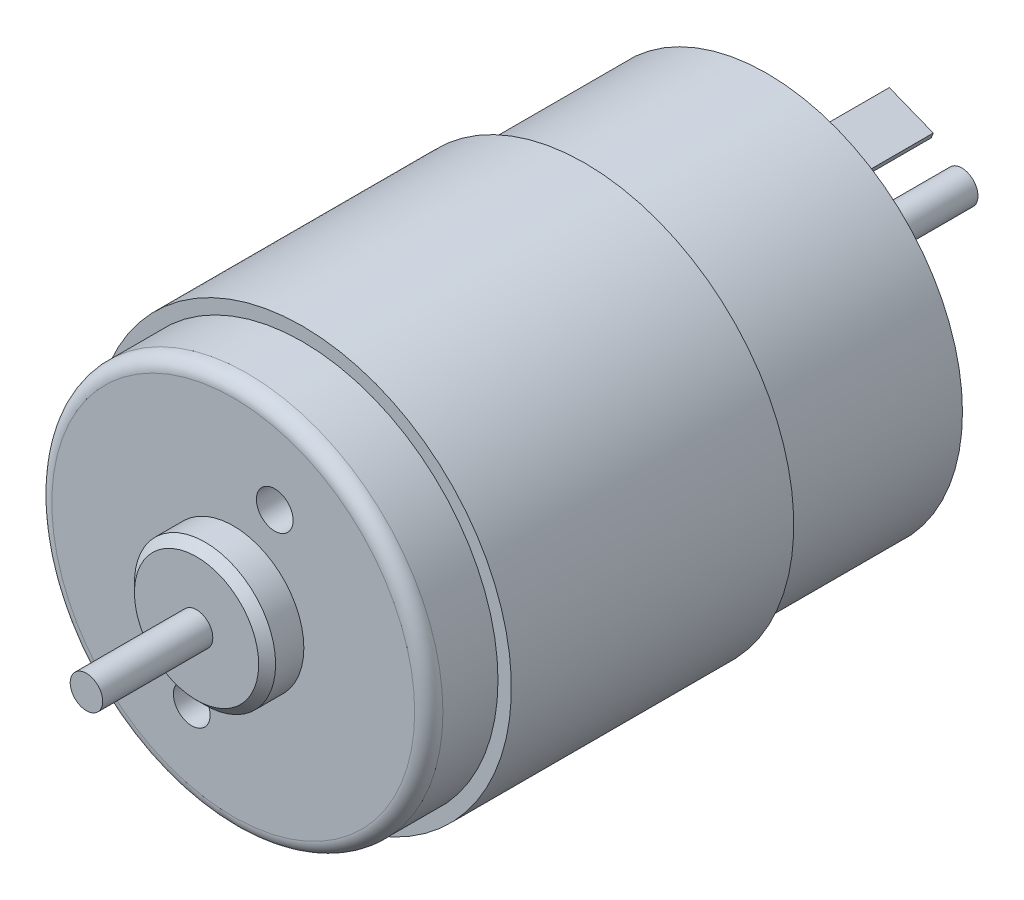
ISO-10303-21;
HEADER;
FILE_DESCRIPTION(('STEP AP214'),'2;1');
FILE_NAME('part.step','',(''),(''),'','','');
FILE_SCHEMA(('AUTOMOTIVE_DESIGN { 1 0 10303 214 1 1 1 1 }'));
ENDSEC;
DATA;
#1=APPLICATION_CONTEXT('core data for automotive mechanical design processes');
#2=APPLICATION_PROTOCOL_DEFINITION('international standard','automotive_design',2000,#1);
#3=PRODUCT_CONTEXT('',#1,'mechanical');
#4=PRODUCT('Part','Part','',(#3));
#5=PRODUCT_RELATED_PRODUCT_CATEGORY('part','',(#4));
#6=PRODUCT_DEFINITION_FORMATION('','',#4);
#7=PRODUCT_DEFINITION_CONTEXT('part definition',#1,'design');
#8=PRODUCT_DEFINITION('design','',#6,#7);
#9=PRODUCT_DEFINITION_SHAPE('','',#8);
#10=(LENGTH_UNIT() NAMED_UNIT(*) SI_UNIT(.MILLI.,.METRE.));
#11=(NAMED_UNIT(*) PLANE_ANGLE_UNIT() SI_UNIT($,.RADIAN.));
#12=(NAMED_UNIT(*) SI_UNIT($,.STERADIAN.) SOLID_ANGLE_UNIT());
#13=UNCERTAINTY_MEASURE_WITH_UNIT(LENGTH_MEASURE(1.E-05),#10,'distance_accuracy_value','');
#14=(GEOMETRIC_REPRESENTATION_CONTEXT(3) GLOBAL_UNCERTAINTY_ASSIGNED_CONTEXT((#13)) GLOBAL_UNIT_ASSIGNED_CONTEXT((#10,
#11,#12)) REPRESENTATION_CONTEXT('',''));
#15=CARTESIAN_POINT('',(0.,0.,0.));
#16=DIRECTION('',(0.,0.,1.));
#17=DIRECTION('',(1.,0.,0.));
#18=AXIS2_PLACEMENT_3D('',#15,#16,#17);
#19=CARTESIAN_POINT('',(0.,0.,0.));
#20=DIRECTION('',(0.,0.,-1.));
#21=DIRECTION('',(0.,1.,0.));
#22=AXIS2_PLACEMENT_3D('',#19,#20,#21);
#23=PLANE('',#22);
#24=CARTESIAN_POINT('',(0.,0.,0.));
#25=DIRECTION('',(0.,0.,-1.));
#26=DIRECTION('',(0.,1.,0.));
#27=AXIS2_PLACEMENT_3D('',#24,#25,#26);
#28=CIRCLE('',#27,5.);
#29=CARTESIAN_POINT('',(0.,5.,0.));
#30=VERTEX_POINT('',#29);
#31=EDGE_CURVE('E251',#30,#30,#28,.T.);
#32=ORIENTED_EDGE('',*,*,#31,.F.);
#33=EDGE_LOOP('',(#32));
#34=FACE_BOUND('',#33,.T.);
#35=CARTESIAN_POINT('',(0.,0.,0.));
#36=DIRECTION('',(0.,0.,-1.));
#37=DIRECTION('',(0.,1.,0.));
#38=AXIS2_PLACEMENT_3D('',#35,#36,#37);
#39=CIRCLE('',#38,13.85);
#40=CARTESIAN_POINT('',(0.,-13.85,0.));
#41=VERTEX_POINT('',#40);
#42=EDGE_CURVE('E160',#41,#41,#39,.T.);
#43=ORIENTED_EDGE('',*,*,#42,.T.);
#44=EDGE_LOOP('',(#43));
#45=FACE_BOUND('',#44,.T.);
#46=DIRECTION('',(-0.93007568020905,0.367367975038207,0.));
#47=VECTOR('',#46,1.);
#48=CARTESIAN_POINT('',(2.51990775857389,10.9391814085095,0.));
#49=LINE('',#48,#47);
#50=CARTESIAN_POINT('',(5.63566128727422,9.70849869213148,0.));
#51=VERTEX_POINT('',#50);
#52=CARTESIAN_POINT('',(2.51990775857389,10.9391814085095,0.));
#53=VERTEX_POINT('',#52);
#54=EDGE_CURVE('E131',#51,#53,#49,.T.);
#55=ORIENTED_EDGE('',*,*,#54,.F.);
#56=DIRECTION('',(-0.367367975038209,-0.93007568020905,0.));
#57=VECTOR('',#56,1.);
#58=CARTESIAN_POINT('',(5.63566128727422,9.70849869213148,0.));
#59=LINE('',#58,#57);
#60=CARTESIAN_POINT('',(5.7826084772895,10.0805289642151,0.));
#61=VERTEX_POINT('',#60);
#62=EDGE_CURVE('E128',#61,#51,#59,.T.);
#63=ORIENTED_EDGE('',*,*,#62,.F.);
#64=DIRECTION('',(0.93007568020905,-0.367367975038207,0.));
#65=VECTOR('',#64,1.);
#66=CARTESIAN_POINT('',(5.7826084772895,10.0805289642151,0.));
#67=LINE('',#66,#65);
#68=CARTESIAN_POINT('',(2.66685494858918,11.3112116805931,0.));
#69=VERTEX_POINT('',#68);
#70=EDGE_CURVE('E140',#69,#61,#67,.T.);
#71=ORIENTED_EDGE('',*,*,#70,.F.);
#72=DIRECTION('',(0.367367975038208,0.93007568020905,0.));
#73=VECTOR('',#72,1.);
#74=CARTESIAN_POINT('',(2.66685494858918,11.3112116805931,0.));
#75=LINE('',#74,#73);
#76=EDGE_CURVE('E148',#53,#69,#75,.T.);
#77=ORIENTED_EDGE('',*,*,#76,.F.);
#78=EDGE_LOOP('',(#55,#63,#71,#77));
#79=FACE_BOUND('',#78,.T.);
#80=DIRECTION('',(-0.930075680209049,0.367367975038209,0.));
#81=VECTOR('',#80,1.);
#82=CARTESIAN_POINT('',(-5.7826084772895,-10.0805289642151,0.));
#83=LINE('',#82,#81);
#84=CARTESIAN_POINT('',(-2.66685494858918,-11.3112116805931,0.));
#85=VERTEX_POINT('',#84);
#86=CARTESIAN_POINT('',(-5.7826084772895,-10.0805289642151,0.));
#87=VERTEX_POINT('',#86);
#88=EDGE_CURVE('E275',#85,#87,#83,.T.);
#89=ORIENTED_EDGE('',*,*,#88,.F.);
#90=DIRECTION('',(-0.36736797503821,-0.930075680209049,0.));
#91=VECTOR('',#90,1.);
#92=CARTESIAN_POINT('',(-2.66685494858918,-11.3112116805931,0.));
#93=LINE('',#92,#91);
#94=CARTESIAN_POINT('',(-2.5199077585739,-10.9391814085095,0.));
#95=VERTEX_POINT('',#94);
#96=EDGE_CURVE('E126',#95,#85,#93,.T.);
#97=ORIENTED_EDGE('',*,*,#96,.F.);
#98=DIRECTION('',(0.930075680209049,-0.367367975038209,0.));
#99=VECTOR('',#98,1.);
#100=CARTESIAN_POINT('',(-2.5199077585739,-10.9391814085095,0.));
#101=LINE('',#100,#99);
#102=CARTESIAN_POINT('',(-5.63566128727422,-9.7084986921315,0.));
#103=VERTEX_POINT('',#102);
#104=EDGE_CURVE('E122',#103,#95,#101,.T.);
#105=ORIENTED_EDGE('',*,*,#104,.F.);
#106=DIRECTION('',(0.367367975038208,0.93007568020905,0.));
#107=VECTOR('',#106,1.);
#108=CARTESIAN_POINT('',(-5.63566128727422,-9.70849869213149,0.));
#109=LINE('',#108,#107);
#110=EDGE_CURVE('E277',#87,#103,#109,.T.);
#111=ORIENTED_EDGE('',*,*,#110,.F.);
#112=EDGE_LOOP('',(#89,#97,#105,#111));
#113=FACE_BOUND('',#112,.T.);
#114=ADVANCED_FACE('F37',(#34,#45,#79,#113),#23,.T.);
#115=CARTESIAN_POINT('',(0.,0.,32.9));
#116=DIRECTION('',(0.,0.,-1.));
#117=DIRECTION('',(0.,1.,0.));
#118=AXIS2_PLACEMENT_3D('',#115,#116,#117);
#119=CYLINDRICAL_SURFACE('',#118,14.8);
#120=CARTESIAN_POINT('',(0.,0.,32.9));
#121=DIRECTION('',(0.,0.,-1.));
#122=DIRECTION('',(0.,1.,0.));
#123=AXIS2_PLACEMENT_3D('',#120,#121,#122);
#124=CIRCLE('',#123,14.8);
#125=CARTESIAN_POINT('',(0.,14.8,32.9));
#126=VERTEX_POINT('',#125);
#127=EDGE_CURVE('E168',#126,#126,#124,.T.);
#128=ORIENTED_EDGE('',*,*,#127,.T.);
#129=EDGE_LOOP('',(#128));
#130=FACE_BOUND('',#129,.T.);
#131=CARTESIAN_POINT('',(0.,0.,12.9));
#132=DIRECTION('',(0.,0.,-1.));
#133=DIRECTION('',(0.,1.,0.));
#134=AXIS2_PLACEMENT_3D('',#131,#132,#133);
#135=CIRCLE('',#134,14.8);
#136=CARTESIAN_POINT('',(0.,14.8,12.9));
#137=VERTEX_POINT('',#136);
#138=EDGE_CURVE('E163',#137,#137,#135,.T.);
#139=ORIENTED_EDGE('',*,*,#138,.F.);
#140=EDGE_LOOP('',(#139));
#141=FACE_BOUND('',#140,.T.);
#142=ADVANCED_FACE('F198',(#130,#141),#119,.T.);
#143=CARTESIAN_POINT('',(14.8,0.,32.9));
#144=DIRECTION('',(0.,0.,1.));
#145=DIRECTION('',(0.,-1.,0.));
#146=AXIS2_PLACEMENT_3D('',#143,#144,#145);
#147=PLANE('',#146);
#148=CARTESIAN_POINT('',(0.,0.,32.9));
#149=DIRECTION('',(0.,0.,1.));
#150=DIRECTION('',(1.,0.,0.));
#151=AXIS2_PLACEMENT_3D('',#148,#149,#150);
#152=CIRCLE('',#151,13.85);
#153=CARTESIAN_POINT('',(13.85,0.,32.9));
#154=VERTEX_POINT('',#153);
#155=EDGE_CURVE('E268',#154,#154,#152,.T.);
#156=ORIENTED_EDGE('',*,*,#155,.F.);
#157=EDGE_LOOP('',(#156));
#158=FACE_BOUND('',#157,.T.);
#159=ORIENTED_EDGE('',*,*,#127,.F.);
#160=EDGE_LOOP('',(#159));
#161=FACE_BOUND('',#160,.T.);
#162=ADVANCED_FACE('F204',(#158,#161),#147,.T.);
#163=CARTESIAN_POINT('',(0.,0.,12.9));
#164=DIRECTION('',(0.,0.,-1.));
#165=DIRECTION('',(0.,1.,0.));
#166=AXIS2_PLACEMENT_3D('',#163,#164,#165);
#167=PLANE('',#166);
#168=CARTESIAN_POINT('',(0.,0.,12.9));
#169=DIRECTION('',(0.,0.,-1.));
#170=DIRECTION('',(0.,1.,0.));
#171=AXIS2_PLACEMENT_3D('',#168,#169,#170);
#172=CIRCLE('',#171,13.85);
#173=CARTESIAN_POINT('',(0.,-13.85,12.9));
#174=VERTEX_POINT('',#173);
#175=EDGE_CURVE('E159',#174,#174,#172,.T.);
#176=ORIENTED_EDGE('',*,*,#175,.F.);
#177=EDGE_LOOP('',(#176));
#178=FACE_BOUND('',#177,.T.);
#179=ORIENTED_EDGE('',*,*,#138,.T.);
#180=EDGE_LOOP('',(#179));
#181=FACE_BOUND('',#180,.T.);
#182=ADVANCED_FACE('F216',(#178,#181),#167,.T.);
#183=CARTESIAN_POINT('',(0.,0.,0.));
#184=DIRECTION('',(0.,0.,1.));
#185=DIRECTION('',(0.,-1.,0.));
#186=AXIS2_PLACEMENT_3D('',#183,#184,#185);
#187=CYLINDRICAL_SURFACE('',#186,13.85);
#188=CARTESIAN_POINT('',(0.,-13.85,0.));
#189=CARTESIAN_POINT('',(0.,-13.85,0.134375000000003));
#190=CARTESIAN_POINT('',(0.,-13.85,0.268750000000003));
#191=CARTESIAN_POINT('',(0.,-13.85,0.537500000000003));
#192=CARTESIAN_POINT('',(0.,-13.85,0.671875000000003));
#193=CARTESIAN_POINT('',(0.,-13.85,0.940625000000003));
#194=CARTESIAN_POINT('',(0.,-13.85,1.075));
#195=CARTESIAN_POINT('',(0.,-13.85,1.34375));
#196=CARTESIAN_POINT('',(0.,-13.85,1.478125));
#197=CARTESIAN_POINT('',(0.,-13.85,1.746875));
#198=CARTESIAN_POINT('',(0.,-13.85,1.88125));
#199=CARTESIAN_POINT('',(0.,-13.85,2.15));
#200=CARTESIAN_POINT('',(0.,-13.85,2.284375));
#201=CARTESIAN_POINT('',(0.,-13.85,2.553125));
#202=CARTESIAN_POINT('',(0.,-13.85,2.6875));
#203=CARTESIAN_POINT('',(0.,-13.85,2.95625));
#204=CARTESIAN_POINT('',(0.,-13.85,3.090625));
#205=CARTESIAN_POINT('',(0.,-13.85,3.359375));
#206=CARTESIAN_POINT('',(0.,-13.85,3.49375));
#207=CARTESIAN_POINT('',(0.,-13.85,3.7625));
#208=CARTESIAN_POINT('',(0.,-13.85,3.896875));
#209=CARTESIAN_POINT('',(0.,-13.85,4.165625));
#210=CARTESIAN_POINT('',(0.,-13.85,4.3));
#211=CARTESIAN_POINT('',(0.,-13.85,4.56875));
#212=CARTESIAN_POINT('',(0.,-13.85,4.703125));
#213=CARTESIAN_POINT('',(0.,-13.85,4.971875));
#214=CARTESIAN_POINT('',(0.,-13.85,5.10625));
#215=CARTESIAN_POINT('',(0.,-13.85,5.375));
#216=CARTESIAN_POINT('',(0.,-13.85,5.509375));
#217=CARTESIAN_POINT('',(0.,-13.85,5.778125));
#218=CARTESIAN_POINT('',(0.,-13.85,5.9125));
#219=CARTESIAN_POINT('',(0.,-13.85,6.18125));
#220=CARTESIAN_POINT('',(0.,-13.85,6.315625));
#221=CARTESIAN_POINT('',(0.,-13.85,6.584375));
#222=CARTESIAN_POINT('',(0.,-13.85,6.71875));
#223=CARTESIAN_POINT('',(0.,-13.85,6.9875));
#224=CARTESIAN_POINT('',(0.,-13.85,7.121875));
#225=CARTESIAN_POINT('',(0.,-13.85,7.390625));
#226=CARTESIAN_POINT('',(0.,-13.85,7.525));
#227=CARTESIAN_POINT('',(0.,-13.85,7.79375));
#228=CARTESIAN_POINT('',(0.,-13.85,7.928125));
#229=CARTESIAN_POINT('',(0.,-13.85,8.196875));
#230=CARTESIAN_POINT('',(0.,-13.85,8.33125));
#231=CARTESIAN_POINT('',(0.,-13.85,8.6));
#232=CARTESIAN_POINT('',(0.,-13.85,8.734375));
#233=CARTESIAN_POINT('',(0.,-13.85,9.003125));
#234=CARTESIAN_POINT('',(0.,-13.85,9.1375));
#235=CARTESIAN_POINT('',(0.,-13.85,9.40625));
#236=CARTESIAN_POINT('',(0.,-13.85,9.540625));
#237=CARTESIAN_POINT('',(0.,-13.85,9.809375));
#238=CARTESIAN_POINT('',(0.,-13.85,9.94375));
#239=CARTESIAN_POINT('',(0.,-13.85,10.2125));
#240=CARTESIAN_POINT('',(0.,-13.85,10.346875));
#241=CARTESIAN_POINT('',(0.,-13.85,10.615625));
#242=CARTESIAN_POINT('',(0.,-13.85,10.75));
#243=CARTESIAN_POINT('',(0.,-13.85,11.01875));
#244=CARTESIAN_POINT('',(0.,-13.85,11.153125));
#245=CARTESIAN_POINT('',(0.,-13.85,11.421875));
#246=CARTESIAN_POINT('',(0.,-13.85,11.55625));
#247=CARTESIAN_POINT('',(0.,-13.85,11.825));
#248=CARTESIAN_POINT('',(0.,-13.85,11.959375));
#249=CARTESIAN_POINT('',(0.,-13.85,12.228125));
#250=CARTESIAN_POINT('',(0.,-13.85,12.3625));
#251=CARTESIAN_POINT('',(0.,-13.85,12.63125));
#252=CARTESIAN_POINT('',(0.,-13.85,12.765625));
#253=CARTESIAN_POINT('',(0.,-13.85,12.9));
#254=B_SPLINE_CURVE_WITH_KNOTS('',3,(#188,#189,#190,#191,#192,#193,#194,#195,#196,#197,#198,
#199,#200,#201,#202,#203,#204,#205,#206,#207,#208,#209,#210,#211,#212,#213,#214,#215,#216,#217,
#218,#219,#220,#221,#222,#223,#224,#225,#226,#227,#228,#229,#230,#231,#232,#233,#234,#235,#236,
#237,#238,#239,#240,#241,#242,#243,#244,#245,#246,#247,#248,#249,#250,#251,#252,#253),
.UNSPECIFIED.,.F.,.F.,(4,2,2,2,2,2,2,2,2,2,2,2,2,2,2,2,2,2,2,2,2,2,2,2,2,2,2,2,2,2,2,2,4),(0.,
0.403125,0.80625,1.209375,1.6125,2.015625,2.41875,2.821875,3.225,3.628125,4.03125,4.434375,
4.8375,5.240625,5.64375,6.046875,6.45,6.853125,7.25625,7.659375,8.0625,8.465625,8.86875,
9.271875,9.675,10.078125,10.48125,10.884375,11.2875,11.690625,12.09375,12.496875,12.9),.UNSPECIFIED.);
#255=EDGE_CURVE('BSEAM213',#41,#174,#254,.T.);
#256=ORIENTED_EDGE('',*,*,#42,.F.);
#257=ORIENTED_EDGE('',*,*,#175,.T.);
#258=ORIENTED_EDGE('',*,*,#255,.T.);
#259=ORIENTED_EDGE('',*,*,#255,.F.);
#260=EDGE_LOOP('',(#256,#258,#257,#259));
#261=FACE_BOUND('',#260,.T.);
#262=ADVANCED_FACE('F213',(#261),#187,.T.);
#263=CARTESIAN_POINT('',(5.63566128727422,9.70849869213148,-6.));
#264=DIRECTION('',(-0.930075680209049,0.367367975038209,0.));
#265=DIRECTION('',(-0.367367975038209,-0.93007568020905,0.));
#266=AXIS2_PLACEMENT_3D('',#263,#264,#265);
#267=PLANE('',#266);
#268=ORIENTED_EDGE('',*,*,#62,.T.);
#269=DIRECTION('',(0.,0.,1.));
#270=VECTOR('',#269,1.);
#271=CARTESIAN_POINT('',(5.63566128727422,9.70849869213148,-6.));
#272=LINE('',#271,#270);
#273=CARTESIAN_POINT('',(5.63566128727422,9.70849869213148,-6.));
#274=VERTEX_POINT('',#273);
#275=EDGE_CURVE('E157',#274,#51,#272,.T.);
#276=ORIENTED_EDGE('',*,*,#275,.F.);
#277=DIRECTION('',(-0.367367975038209,-0.93007568020905,0.));
#278=VECTOR('',#277,1.);
#279=CARTESIAN_POINT('',(5.63566128727422,9.70849869213148,-6.));
#280=LINE('',#279,#278);
#281=CARTESIAN_POINT('',(5.7826084772895,10.0805289642151,-6.));
#282=VERTEX_POINT('',#281);
#283=EDGE_CURVE('E136',#282,#274,#280,.T.);
#284=ORIENTED_EDGE('',*,*,#283,.F.);
#285=DIRECTION('',(0.,0.,1.));
#286=VECTOR('',#285,1.);
#287=CARTESIAN_POINT('',(5.7826084772895,10.0805289642151,-6.));
#288=LINE('',#287,#286);
#289=EDGE_CURVE('E145',#282,#61,#288,.T.);
#290=ORIENTED_EDGE('',*,*,#289,.T.);
#291=EDGE_LOOP('',(#268,#276,#284,#290));
#292=FACE_BOUND('',#291,.T.);
#293=ADVANCED_FACE('F211',(#292),#267,.F.);
#294=CARTESIAN_POINT('',(2.51990775857389,10.9391814085095,-6.));
#295=DIRECTION('',(0.367367975038207,0.93007568020905,0.));
#296=DIRECTION('',(-0.93007568020905,0.367367975038207,0.));
#297=AXIS2_PLACEMENT_3D('',#294,#295,#296);
#298=PLANE('',#297);
#299=ORIENTED_EDGE('',*,*,#54,.T.);
#300=DIRECTION('',(0.,0.,1.));
#301=VECTOR('',#300,1.);
#302=CARTESIAN_POINT('',(2.51990775857389,10.9391814085095,-6.));
#303=LINE('',#302,#301);
#304=CARTESIAN_POINT('',(2.51990775857389,10.9391814085095,-6.));
#305=VERTEX_POINT('',#304);
#306=EDGE_CURVE('E154',#305,#53,#303,.T.);
#307=ORIENTED_EDGE('',*,*,#306,.F.);
#308=DIRECTION('',(-0.93007568020905,0.367367975038207,0.));
#309=VECTOR('',#308,1.);
#310=CARTESIAN_POINT('',(2.51990775857389,10.9391814085095,-6.));
#311=LINE('',#310,#309);
#312=EDGE_CURVE('E139',#274,#305,#311,.T.);
#313=ORIENTED_EDGE('',*,*,#312,.F.);
#314=ORIENTED_EDGE('',*,*,#275,.T.);
#315=EDGE_LOOP('',(#299,#307,#313,#314));
#316=FACE_BOUND('',#315,.T.);
#317=ADVANCED_FACE('F310',(#316),#298,.F.);
#318=CARTESIAN_POINT('',(2.66685494858918,11.3112116805931,-6.));
#319=DIRECTION('',(0.93007568020905,-0.367367975038208,0.));
#320=DIRECTION('',(0.367367975038208,0.93007568020905,0.));
#321=AXIS2_PLACEMENT_3D('',#318,#319,#320);
#322=PLANE('',#321);
#323=ORIENTED_EDGE('',*,*,#76,.T.);
#324=DIRECTION('',(0.,0.,1.));
#325=VECTOR('',#324,1.);
#326=CARTESIAN_POINT('',(2.66685494858918,11.3112116805931,-6.));
#327=LINE('',#326,#325);
#328=CARTESIAN_POINT('',(2.66685494858918,11.3112116805931,-6.));
#329=VERTEX_POINT('',#328);
#330=EDGE_CURVE('E60',#329,#69,#327,.T.);
#331=ORIENTED_EDGE('',*,*,#330,.F.);
#332=DIRECTION('',(0.367367975038208,0.93007568020905,0.));
#333=VECTOR('',#332,1.);
#334=CARTESIAN_POINT('',(2.66685494858918,11.3112116805931,-6.));
#335=LINE('',#334,#333);
#336=EDGE_CURVE('E142',#305,#329,#335,.T.);
#337=ORIENTED_EDGE('',*,*,#336,.F.);
#338=ORIENTED_EDGE('',*,*,#306,.T.);
#339=EDGE_LOOP('',(#323,#331,#337,#338));
#340=FACE_BOUND('',#339,.T.);
#341=ADVANCED_FACE('F308',(#340),#322,.F.);
#342=CARTESIAN_POINT('',(5.7826084772895,10.0805289642151,-6.));
#343=DIRECTION('',(-0.367367975038207,-0.93007568020905,0.));
#344=DIRECTION('',(0.93007568020905,-0.367367975038207,0.));
#345=AXIS2_PLACEMENT_3D('',#342,#343,#344);
#346=PLANE('',#345);
#347=ORIENTED_EDGE('',*,*,#70,.T.);
#348=ORIENTED_EDGE('',*,*,#289,.F.);
#349=DIRECTION('',(0.93007568020905,-0.367367975038207,0.));
#350=VECTOR('',#349,1.);
#351=CARTESIAN_POINT('',(5.7826084772895,10.0805289642151,-6.));
#352=LINE('',#351,#350);
#353=EDGE_CURVE('E144',#329,#282,#352,.T.);
#354=ORIENTED_EDGE('',*,*,#353,.F.);
#355=ORIENTED_EDGE('',*,*,#330,.T.);
#356=EDGE_LOOP('',(#347,#348,#354,#355));
#357=FACE_BOUND('',#356,.T.);
#358=ADVANCED_FACE('F304',(#357),#346,.F.);
#359=CARTESIAN_POINT('',(0.,0.,-6.));
#360=DIRECTION('',(0.,0.,1.));
#361=DIRECTION('',(0.,-1.,0.));
#362=AXIS2_PLACEMENT_3D('',#359,#360,#361);
#363=PLANE('',#362);
#364=ORIENTED_EDGE('',*,*,#283,.T.);
#365=ORIENTED_EDGE('',*,*,#312,.T.);
#366=ORIENTED_EDGE('',*,*,#336,.T.);
#367=ORIENTED_EDGE('',*,*,#353,.T.);
#368=EDGE_LOOP('',(#364,#365,#366,#367));
#369=FACE_BOUND('',#368,.T.);
#370=ADVANCED_FACE('F301',(#369),#363,.F.);
#371=CARTESIAN_POINT('',(-2.66685494858918,-11.3112116805931,-6.));
#372=DIRECTION('',(-0.930075680209049,0.36736797503821,0.));
#373=DIRECTION('',(-0.36736797503821,-0.930075680209049,0.));
#374=AXIS2_PLACEMENT_3D('',#371,#372,#373);
#375=PLANE('',#374);
#376=ORIENTED_EDGE('',*,*,#96,.T.);
#377=DIRECTION('',(0.,0.,1.));
#378=VECTOR('',#377,1.);
#379=CARTESIAN_POINT('',(-2.66685494858918,-11.3112116805931,-6.));
#380=LINE('',#379,#378);
#381=CARTESIAN_POINT('',(-2.66685494858918,-11.3112116805931,-6.));
#382=VERTEX_POINT('',#381);
#383=EDGE_CURVE('E107',#382,#85,#380,.T.);
#384=ORIENTED_EDGE('',*,*,#383,.F.);
#385=DIRECTION('',(-0.36736797503821,-0.930075680209049,0.));
#386=VECTOR('',#385,1.);
#387=CARTESIAN_POINT('',(-2.66685494858918,-11.3112116805931,-6.));
#388=LINE('',#387,#386);
#389=CARTESIAN_POINT('',(-2.5199077585739,-10.9391814085095,-6.));
#390=VERTEX_POINT('',#389);
#391=EDGE_CURVE('E114',#390,#382,#388,.T.);
#392=ORIENTED_EDGE('',*,*,#391,.F.);
#393=DIRECTION('',(0.,0.,1.));
#394=VECTOR('',#393,1.);
#395=CARTESIAN_POINT('',(-2.5199077585739,-10.9391814085095,-6.));
#396=LINE('',#395,#394);
#397=EDGE_CURVE('E273',#390,#95,#396,.T.);
#398=ORIENTED_EDGE('',*,*,#397,.T.);
#399=EDGE_LOOP('',(#376,#384,#392,#398));
#400=FACE_BOUND('',#399,.T.);
#401=ADVANCED_FACE('F124',(#400),#375,.F.);
#402=CARTESIAN_POINT('',(-5.7826084772895,-10.0805289642151,-6.));
#403=DIRECTION('',(0.367367975038209,0.930075680209049,0.));
#404=DIRECTION('',(-0.93007568020905,0.367367975038209,0.));
#405=AXIS2_PLACEMENT_3D('',#402,#403,#404);
#406=PLANE('',#405);
#407=ORIENTED_EDGE('',*,*,#88,.T.);
#408=DIRECTION('',(0.,0.,1.));
#409=VECTOR('',#408,1.);
#410=CARTESIAN_POINT('',(-5.7826084772895,-10.0805289642151,-6.));
#411=LINE('',#410,#409);
#412=CARTESIAN_POINT('',(-5.7826084772895,-10.0805289642151,-6.));
#413=VERTEX_POINT('',#412);
#414=EDGE_CURVE('E110',#413,#87,#411,.T.);
#415=ORIENTED_EDGE('',*,*,#414,.F.);
#416=DIRECTION('',(-0.930075680209049,0.367367975038209,0.));
#417=VECTOR('',#416,1.);
#418=CARTESIAN_POINT('',(-5.7826084772895,-10.0805289642151,-6.));
#419=LINE('',#418,#417);
#420=EDGE_CURVE('E103',#382,#413,#419,.T.);
#421=ORIENTED_EDGE('',*,*,#420,.F.);
#422=ORIENTED_EDGE('',*,*,#383,.T.);
#423=EDGE_LOOP('',(#407,#415,#421,#422));
#424=FACE_BOUND('',#423,.T.);
#425=ADVANCED_FACE('F105',(#424),#406,.F.);
#426=CARTESIAN_POINT('',(-5.63566128727422,-9.70849869213149,-6.));
#427=DIRECTION('',(0.930075680209049,-0.367367975038208,0.));
#428=DIRECTION('',(0.367367975038208,0.93007568020905,0.));
#429=AXIS2_PLACEMENT_3D('',#426,#427,#428);
#430=PLANE('',#429);
#431=ORIENTED_EDGE('',*,*,#110,.T.);
#432=DIRECTION('',(0.,0.,1.));
#433=VECTOR('',#432,1.);
#434=CARTESIAN_POINT('',(-5.63566128727422,-9.70849869213149,-6.));
#435=LINE('',#434,#433);
#436=CARTESIAN_POINT('',(-5.63566128727422,-9.70849869213149,-6.));
#437=VERTEX_POINT('',#436);
#438=EDGE_CURVE('E52',#437,#103,#435,.T.);
#439=ORIENTED_EDGE('',*,*,#438,.F.);
#440=DIRECTION('',(0.367367975038208,0.93007568020905,0.));
#441=VECTOR('',#440,1.);
#442=CARTESIAN_POINT('',(-5.63566128727422,-9.70849869213149,-6.));
#443=LINE('',#442,#441);
#444=EDGE_CURVE('E113',#413,#437,#443,.T.);
#445=ORIENTED_EDGE('',*,*,#444,.F.);
#446=ORIENTED_EDGE('',*,*,#414,.T.);
#447=EDGE_LOOP('',(#431,#439,#445,#446));
#448=FACE_BOUND('',#447,.T.);
#449=ADVANCED_FACE('F284',(#448),#430,.F.);
#450=CARTESIAN_POINT('',(-2.5199077585739,-10.9391814085095,-6.));
#451=DIRECTION('',(-0.367367975038209,-0.93007568020905,0.));
#452=DIRECTION('',(0.93007568020905,-0.367367975038209,0.));
#453=AXIS2_PLACEMENT_3D('',#450,#451,#452);
#454=PLANE('',#453);
#455=ORIENTED_EDGE('',*,*,#104,.T.);
#456=ORIENTED_EDGE('',*,*,#397,.F.);
#457=DIRECTION('',(0.930075680209049,-0.367367975038209,0.));
#458=VECTOR('',#457,1.);
#459=CARTESIAN_POINT('',(-2.5199077585739,-10.9391814085095,-6.));
#460=LINE('',#459,#458);
#461=EDGE_CURVE('E118',#437,#390,#460,.T.);
#462=ORIENTED_EDGE('',*,*,#461,.F.);
#463=ORIENTED_EDGE('',*,*,#438,.T.);
#464=EDGE_LOOP('',(#455,#456,#462,#463));
#465=FACE_BOUND('',#464,.T.);
#466=ADVANCED_FACE('F285',(#465),#454,.F.);
#467=CARTESIAN_POINT('',(0.,0.,-6.));
#468=DIRECTION('',(0.,0.,1.));
#469=DIRECTION('',(0.,-1.,0.));
#470=AXIS2_PLACEMENT_3D('',#467,#468,#469);
#471=PLANE('',#470);
#472=ORIENTED_EDGE('',*,*,#391,.T.);
#473=ORIENTED_EDGE('',*,*,#420,.T.);
#474=ORIENTED_EDGE('',*,*,#444,.T.);
#475=ORIENTED_EDGE('',*,*,#461,.T.);
#476=EDGE_LOOP('',(#472,#473,#474,#475));
#477=FACE_BOUND('',#476,.T.);
#478=ADVANCED_FACE('F117',(#477),#471,.F.);
#479=CARTESIAN_POINT('',(0.,0.,37.8));
#480=DIRECTION('',(0.,0.,-1.));
#481=DIRECTION('',(-1.,0.,0.));
#482=AXIS2_PLACEMENT_3D('',#479,#480,#481);
#483=CYLINDRICAL_SURFACE('',#482,13.85);
#484=CARTESIAN_POINT('',(0.,0.,36.8));
#485=DIRECTION('',(0.,0.,1.));
#486=DIRECTION('',(1.,0.,0.));
#487=AXIS2_PLACEMENT_3D('',#484,#485,#486);
#488=CIRCLE('',#487,13.85);
#489=CARTESIAN_POINT('',(13.85,0.,36.8));
#490=VERTEX_POINT('',#489);
#491=EDGE_CURVE('E11',#490,#490,#488,.F.);
#492=ORIENTED_EDGE('',*,*,#491,.T.);
#493=EDGE_LOOP('',(#492));
#494=FACE_BOUND('',#493,.T.);
#495=ORIENTED_EDGE('',*,*,#155,.T.);
#496=EDGE_LOOP('',(#495));
#497=FACE_BOUND('',#496,.T.);
#498=ADVANCED_FACE('F292',(#494,#497),#483,.T.);
#499=CARTESIAN_POINT('',(0.,0.,37.8));
#500=DIRECTION('',(0.,0.,1.));
#501=DIRECTION('',(1.,0.,0.));
#502=AXIS2_PLACEMENT_3D('',#499,#500,#501);
#503=PLANE('',#502);
#504=CARTESIAN_POINT('',(0.,0.,37.8));
#505=DIRECTION('',(0.,0.,1.));
#506=DIRECTION('',(1.,0.,0.));
#507=AXIS2_PLACEMENT_3D('',#504,#505,#506);
#508=CIRCLE('',#507,12.85);
#509=CARTESIAN_POINT('',(12.85,0.,37.8));
#510=VERTEX_POINT('',#509);
#511=EDGE_CURVE('E45',#510,#510,#508,.T.);
#512=ORIENTED_EDGE('',*,*,#511,.T.);
#513=EDGE_LOOP('',(#512));
#514=FACE_BOUND('',#513,.T.);
#515=CARTESIAN_POINT('',(-2.93894380030564,-7.44060544167245,37.8));
#516=DIRECTION('',(0.,0.,1.));
#517=DIRECTION('',(1.,0.,0.));
#518=AXIS2_PLACEMENT_3D('',#515,#516,#517);
#519=CIRCLE('',#518,1.29999999999999);
#520=CARTESIAN_POINT('',(-1.63894380030565,-7.44060544167245,37.8));
#521=VERTEX_POINT('',#520);
#522=EDGE_CURVE('E548',#521,#521,#519,.T.);
#523=ORIENTED_EDGE('',*,*,#522,.F.);
#524=EDGE_LOOP('',(#523));
#525=FACE_BOUND('',#524,.T.);
#526=CARTESIAN_POINT('',(2.93894380030561,7.44060544167238,37.8));
#527=DIRECTION('',(0.,0.,1.));
#528=DIRECTION('',(1.,0.,0.));
#529=AXIS2_PLACEMENT_3D('',#526,#527,#528);
#530=CIRCLE('',#529,1.29999999999999);
#531=CARTESIAN_POINT('',(4.2389438003056,7.44060544167238,37.8));
#532=VERTEX_POINT('',#531);
#533=EDGE_CURVE('E254',#532,#532,#530,.T.);
#534=ORIENTED_EDGE('',*,*,#533,.F.);
#535=EDGE_LOOP('',(#534));
#536=FACE_BOUND('',#535,.T.);
#537=CARTESIAN_POINT('',(0.,0.,37.8));
#538=DIRECTION('',(0.,0.,1.));
#539=DIRECTION('',(1.,0.,0.));
#540=AXIS2_PLACEMENT_3D('',#537,#538,#539);
#541=CIRCLE('',#540,5.);
#542=CARTESIAN_POINT('',(5.,0.,37.8));
#543=VERTEX_POINT('',#542);
#544=EDGE_CURVE('E263',#543,#543,#541,.T.);
#545=ORIENTED_EDGE('',*,*,#544,.F.);
#546=EDGE_LOOP('',(#545));
#547=FACE_BOUND('',#546,.T.);
#548=ADVANCED_FACE('F185',(#514,#525,#536,#547),#503,.T.);
#549=CARTESIAN_POINT('',(0.,0.,40.4));
#550=DIRECTION('',(0.,0.,-1.));
#551=DIRECTION('',(-1.,0.,0.));
#552=AXIS2_PLACEMENT_3D('',#549,#550,#551);
#553=CYLINDRICAL_SURFACE('',#552,5.);
#554=CARTESIAN_POINT('',(0.,0.,39.7999999999735));
#555=DIRECTION('',(0.,0.,1.));
#556=DIRECTION('',(1.,0.,0.));
#557=AXIS2_PLACEMENT_3D('',#554,#555,#556);
#558=CIRCLE('',#557,5.);
#559=CARTESIAN_POINT('',(5.,0.,39.7999999999735));
#560=VERTEX_POINT('',#559);
#561=EDGE_CURVE('E180',#560,#560,#558,.F.);
#562=ORIENTED_EDGE('',*,*,#561,.T.);
#563=EDGE_LOOP('',(#562));
#564=FACE_BOUND('',#563,.T.);
#565=ORIENTED_EDGE('',*,*,#544,.T.);
#566=EDGE_LOOP('',(#565));
#567=FACE_BOUND('',#566,.T.);
#568=ADVANCED_FACE('F422',(#564,#567),#553,.T.);
#569=CARTESIAN_POINT('',(0.,0.,40.4));
#570=DIRECTION('',(0.,0.,1.));
#571=DIRECTION('',(1.,0.,0.));
#572=AXIS2_PLACEMENT_3D('',#569,#570,#571);
#573=PLANE('',#572);
#574=CARTESIAN_POINT('',(0.,0.,40.4));
#575=DIRECTION('',(0.,0.,1.));
#576=DIRECTION('',(1.,0.,0.));
#577=AXIS2_PLACEMENT_3D('',#574,#575,#576);
#578=CIRCLE('',#577,4.39999999998535);
#579=CARTESIAN_POINT('',(4.39999999998535,0.,40.4));
#580=VERTEX_POINT('',#579);
#581=EDGE_CURVE('E177',#580,#580,#578,.T.);
#582=ORIENTED_EDGE('',*,*,#581,.T.);
#583=EDGE_LOOP('',(#582));
#584=FACE_BOUND('',#583,.T.);
#585=CARTESIAN_POINT('',(0.,0.,40.4));
#586=DIRECTION('',(0.,0.,1.));
#587=DIRECTION('',(1.,0.,0.));
#588=AXIS2_PLACEMENT_3D('',#585,#586,#587);
#589=CIRCLE('',#588,1.15);
#590=CARTESIAN_POINT('',(1.15,0.,40.4));
#591=VERTEX_POINT('',#590);
#592=EDGE_CURVE('E259',#591,#591,#589,.T.);
#593=ORIENTED_EDGE('',*,*,#592,.F.);
#594=EDGE_LOOP('',(#593));
#595=FACE_BOUND('',#594,.T.);
#596=ADVANCED_FACE('F430',(#584,#595),#573,.T.);
#597=CARTESIAN_POINT('',(0.,0.,48.2));
#598=DIRECTION('',(0.,0.,-1.));
#599=DIRECTION('',(-1.,0.,0.));
#600=AXIS2_PLACEMENT_3D('',#597,#598,#599);
#601=CYLINDRICAL_SURFACE('',#600,1.15);
#602=CARTESIAN_POINT('',(0.,0.,48.2));
#603=DIRECTION('',(0.,0.,1.));
#604=DIRECTION('',(1.,0.,0.));
#605=AXIS2_PLACEMENT_3D('',#602,#603,#604);
#606=CIRCLE('',#605,1.15);
#607=CARTESIAN_POINT('',(1.15,0.,48.2));
#608=VERTEX_POINT('',#607);
#609=EDGE_CURVE('E260',#608,#608,#606,.T.);
#610=ORIENTED_EDGE('',*,*,#609,.F.);
#611=EDGE_LOOP('',(#610));
#612=FACE_BOUND('',#611,.T.);
#613=ORIENTED_EDGE('',*,*,#592,.T.);
#614=EDGE_LOOP('',(#613));
#615=FACE_BOUND('',#614,.T.);
#616=ADVANCED_FACE('F440',(#612,#615),#601,.T.);
#617=CARTESIAN_POINT('',(0.,0.,48.2));
#618=DIRECTION('',(0.,0.,1.));
#619=DIRECTION('',(1.,0.,0.));
#620=AXIS2_PLACEMENT_3D('',#617,#618,#619);
#621=PLANE('',#620);
#622=ORIENTED_EDGE('',*,*,#609,.T.);
#623=EDGE_LOOP('',(#622));
#624=FACE_BOUND('',#623,.T.);
#625=ADVANCED_FACE('F449',(#624),#621,.T.);
#626=CARTESIAN_POINT('',(0.,0.,-2.6));
#627=DIRECTION('',(0.,0.,1.));
#628=DIRECTION('',(0.,-1.,0.));
#629=AXIS2_PLACEMENT_3D('',#626,#627,#628);
#630=CYLINDRICAL_SURFACE('',#629,5.);
#631=CARTESIAN_POINT('',(0.,0.,-1.99999999997346));
#632=DIRECTION('',(0.,0.,-1.));
#633=DIRECTION('',(0.,1.,0.));
#634=AXIS2_PLACEMENT_3D('',#631,#632,#633);
#635=CIRCLE('',#634,5.);
#636=CARTESIAN_POINT('',(0.,5.,-1.99999999997346));
#637=VERTEX_POINT('',#636);
#638=EDGE_CURVE('E174',#637,#637,#635,.F.);
#639=ORIENTED_EDGE('',*,*,#638,.T.);
#640=EDGE_LOOP('',(#639));
#641=FACE_BOUND('',#640,.T.);
#642=ORIENTED_EDGE('',*,*,#31,.T.);
#643=EDGE_LOOP('',(#642));
#644=FACE_BOUND('',#643,.T.);
#645=ADVANCED_FACE('F241',(#641,#644),#630,.T.);
#646=CARTESIAN_POINT('',(0.,0.,-2.6));
#647=DIRECTION('',(0.,0.,-1.));
#648=DIRECTION('',(0.,1.,0.));
#649=AXIS2_PLACEMENT_3D('',#646,#647,#648);
#650=PLANE('',#649);
#651=CARTESIAN_POINT('',(0.,0.,-2.6));
#652=DIRECTION('',(0.,0.,-1.));
#653=DIRECTION('',(0.,1.,0.));
#654=AXIS2_PLACEMENT_3D('',#651,#652,#653);
#655=CIRCLE('',#654,4.39999999998535);
#656=CARTESIAN_POINT('',(0.,4.39999999998535,-2.6));
#657=VERTEX_POINT('',#656);
#658=EDGE_CURVE('E171',#657,#657,#655,.T.);
#659=ORIENTED_EDGE('',*,*,#658,.T.);
#660=EDGE_LOOP('',(#659));
#661=FACE_BOUND('',#660,.T.);
#662=CARTESIAN_POINT('',(0.,0.,-2.6));
#663=DIRECTION('',(0.,0.,-1.));
#664=DIRECTION('',(0.,1.,0.));
#665=AXIS2_PLACEMENT_3D('',#662,#663,#664);
#666=CIRCLE('',#665,1.15);
#667=CARTESIAN_POINT('',(0.,1.15,-2.6));
#668=VERTEX_POINT('',#667);
#669=EDGE_CURVE('E245',#668,#668,#666,.T.);
#670=ORIENTED_EDGE('',*,*,#669,.F.);
#671=EDGE_LOOP('',(#670));
#672=FACE_BOUND('',#671,.T.);
#673=ADVANCED_FACE('F237',(#661,#672),#650,.T.);
#674=CARTESIAN_POINT('',(0.,0.,-13.8));
#675=DIRECTION('',(0.,0.,1.));
#676=DIRECTION('',(0.,-1.,0.));
#677=AXIS2_PLACEMENT_3D('',#674,#675,#676);
#678=CYLINDRICAL_SURFACE('',#677,1.15);
#679=CARTESIAN_POINT('',(0.,0.,-13.8));
#680=DIRECTION('',(0.,0.,-1.));
#681=DIRECTION('',(0.,1.,0.));
#682=AXIS2_PLACEMENT_3D('',#679,#680,#681);
#683=CIRCLE('',#682,1.15);
#684=CARTESIAN_POINT('',(0.,1.15,-13.8));
#685=VERTEX_POINT('',#684);
#686=EDGE_CURVE('E247',#685,#685,#683,.T.);
#687=ORIENTED_EDGE('',*,*,#686,.F.);
#688=EDGE_LOOP('',(#687));
#689=FACE_BOUND('',#688,.T.);
#690=ORIENTED_EDGE('',*,*,#669,.T.);
#691=EDGE_LOOP('',(#690));
#692=FACE_BOUND('',#691,.T.);
#693=ADVANCED_FACE('F240',(#689,#692),#678,.T.);
#694=CARTESIAN_POINT('',(0.,0.,-13.8));
#695=DIRECTION('',(0.,0.,-1.));
#696=DIRECTION('',(0.,1.,0.));
#697=AXIS2_PLACEMENT_3D('',#694,#695,#696);
#698=PLANE('',#697);
#699=ORIENTED_EDGE('',*,*,#686,.T.);
#700=EDGE_LOOP('',(#699));
#701=FACE_BOUND('',#700,.T.);
#702=ADVANCED_FACE('F476',(#701),#698,.T.);
#703=CARTESIAN_POINT('',(2.93894380030561,7.44060544167238,34.5836800131004));
#704=DIRECTION('',(0.,0.,-1.));
#705=DIRECTION('',(-1.,0.,0.));
#706=AXIS2_PLACEMENT_3D('',#703,#704,#705);
#707=PLANE('',#706);
#708=CARTESIAN_POINT('',(2.93894380030561,7.44060544167238,34.5836800131004));
#709=DIRECTION('',(0.,0.,1.));
#710=DIRECTION('',(1.,0.,0.));
#711=AXIS2_PLACEMENT_3D('',#708,#709,#710);
#712=CIRCLE('',#711,1.29999999999999);
#713=CARTESIAN_POINT('',(4.2389438003056,7.44060544167238,34.5836800131004));
#714=VERTEX_POINT('',#713);
#715=EDGE_CURVE('E248',#714,#714,#712,.T.);
#716=ORIENTED_EDGE('',*,*,#715,.T.);
#717=EDGE_LOOP('',(#716));
#718=FACE_BOUND('',#717,.T.);
#719=ADVANCED_FACE('F485',(#718),#707,.F.);
#720=CARTESIAN_POINT('',(2.93894380030561,7.44060544167238,37.8));
#721=DIRECTION('',(0.,0.,1.));
#722=DIRECTION('',(1.,0.,0.));
#723=AXIS2_PLACEMENT_3D('',#720,#721,#722);
#724=CYLINDRICAL_SURFACE('',#723,1.29999999999999);
#725=ORIENTED_EDGE('',*,*,#715,.F.);
#726=EDGE_LOOP('',(#725));
#727=FACE_BOUND('',#726,.T.);
#728=ORIENTED_EDGE('',*,*,#533,.T.);
#729=EDGE_LOOP('',(#728));
#730=FACE_BOUND('',#729,.T.);
#731=ADVANCED_FACE('F494',(#727,#730),#724,.F.);
#732=CARTESIAN_POINT('',(-2.93894380030564,-7.44060544167245,34.5836800131004));
#733=DIRECTION('',(0.,0.,-1.));
#734=DIRECTION('',(-1.,0.,0.));
#735=AXIS2_PLACEMENT_3D('',#732,#733,#734);
#736=PLANE('',#735);
#737=CARTESIAN_POINT('',(-2.93894380030564,-7.44060544167245,34.5836800131004));
#738=DIRECTION('',(0.,0.,1.));
#739=DIRECTION('',(1.,0.,0.));
#740=AXIS2_PLACEMENT_3D('',#737,#738,#739);
#741=CIRCLE('',#740,1.29999999999999);
#742=CARTESIAN_POINT('',(-1.63894380030566,-7.44060544167245,34.5836800131004));
#743=VERTEX_POINT('',#742);
#744=EDGE_CURVE('E547',#743,#743,#741,.T.);
#745=ORIENTED_EDGE('',*,*,#744,.T.);
#746=EDGE_LOOP('',(#745));
#747=FACE_BOUND('',#746,.T.);
#748=ADVANCED_FACE('F230',(#747),#736,.F.);
#749=CARTESIAN_POINT('',(-2.93894380030564,-7.44060544167245,37.8));
#750=DIRECTION('',(0.,0.,1.));
#751=DIRECTION('',(1.,0.,0.));
#752=AXIS2_PLACEMENT_3D('',#749,#750,#751);
#753=CYLINDRICAL_SURFACE('',#752,1.29999999999999);
#754=ORIENTED_EDGE('',*,*,#744,.F.);
#755=EDGE_LOOP('',(#754));
#756=FACE_BOUND('',#755,.T.);
#757=ORIENTED_EDGE('',*,*,#522,.T.);
#758=EDGE_LOOP('',(#757));
#759=FACE_BOUND('',#758,.T.);
#760=ADVANCED_FACE('F225',(#756,#759),#753,.F.);
#761=CARTESIAN_POINT('',(0.,0.,-2.6));
#762=DIRECTION('',(0.,0.,1.));
#763=DIRECTION('',(0.,-1.,0.));
#764=AXIS2_PLACEMENT_3D('',#761,#762,#763);
#765=CONICAL_SURFACE('',#764,4.39999999998535,0.785398163387543);
#766=ORIENTED_EDGE('',*,*,#638,.F.);
#767=EDGE_LOOP('',(#766));
#768=FACE_BOUND('',#767,.T.);
#769=ORIENTED_EDGE('',*,*,#658,.F.);
#770=EDGE_LOOP('',(#769));
#771=FACE_BOUND('',#770,.T.);
#772=ADVANCED_FACE('F194',(#768,#771),#765,.T.);
#773=CARTESIAN_POINT('',(0.,0.,40.4));
#774=DIRECTION('',(0.,0.,-1.));
#775=DIRECTION('',(-1.,0.,0.));
#776=AXIS2_PLACEMENT_3D('',#773,#774,#775);
#777=CONICAL_SURFACE('',#776,4.39999999998535,0.78539816338754);
#778=ORIENTED_EDGE('',*,*,#561,.F.);
#779=EDGE_LOOP('',(#778));
#780=FACE_BOUND('',#779,.T.);
#781=ORIENTED_EDGE('',*,*,#581,.F.);
#782=EDGE_LOOP('',(#781));
#783=FACE_BOUND('',#782,.T.);
#784=ADVANCED_FACE('F189',(#780,#783),#777,.T.);
#785=CARTESIAN_POINT('',(0.,0.,36.8));
#786=DIRECTION('',(0.,0.,1.));
#787=DIRECTION('',(1.,0.,0.));
#788=AXIS2_PLACEMENT_3D('',#785,#786,#787);
#789=TOROIDAL_SURFACE('',#788,12.85,0.999999999999999);
#790=ORIENTED_EDGE('',*,*,#491,.F.);
#791=EDGE_LOOP('',(#790));
#792=FACE_BOUND('',#791,.T.);
#793=ORIENTED_EDGE('',*,*,#511,.F.);
#794=EDGE_LOOP('',(#793));
#795=FACE_BOUND('',#794,.T.);
#796=ADVANCED_FACE('F39',(#792,#795),#789,.T.);
#797=CLOSED_SHELL('',(#114,#142,#162,#182,#262,#293,#317,#341,#358,#370,#401,#425,#449,#466,
#478,#498,#548,#568,#596,#616,#625,#645,#673,#693,#702,#719,#731,#748,#760,#772,#784,#796));
#798=MANIFOLD_SOLID_BREP('B2',#797);
#799=ADVANCED_BREP_SHAPE_REPRESENTATION('',(#18,#798),#14);
#800=SHAPE_DEFINITION_REPRESENTATION(#9,#799);
ENDSEC;
END-ISO-10303-21;
